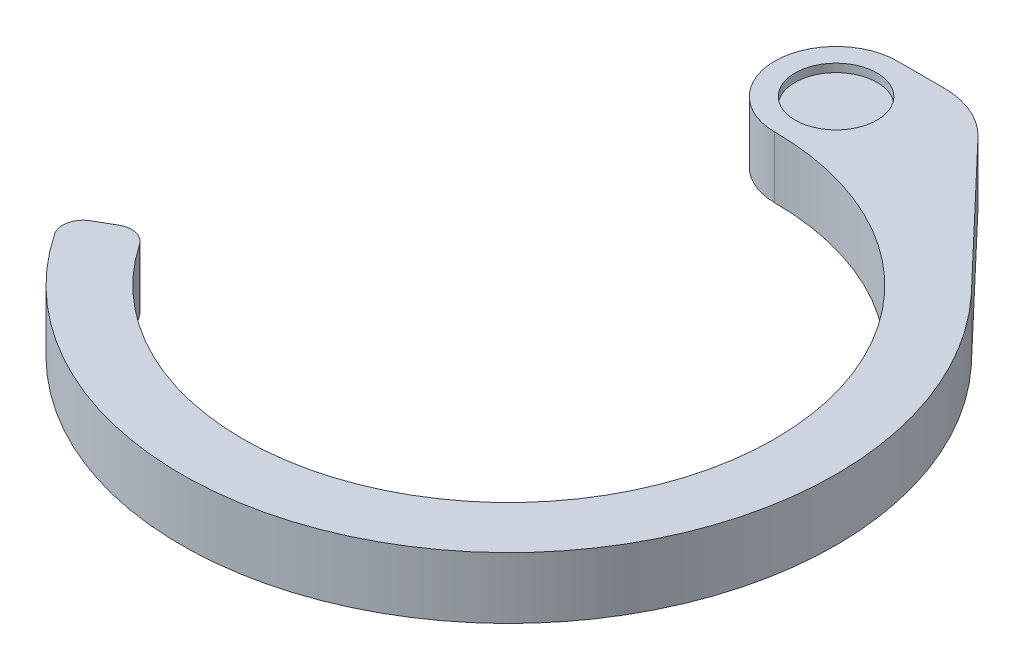
ISO-10303-21;
HEADER;
FILE_DESCRIPTION(('STEP AP214'),'2;1');
FILE_NAME('part.step','',(''),(''),'','','');
FILE_SCHEMA(('AUTOMOTIVE_DESIGN { 1 0 10303 214 1 1 1 1 }'));
ENDSEC;
DATA;
#1=APPLICATION_CONTEXT('core data for automotive mechanical design processes');
#2=APPLICATION_PROTOCOL_DEFINITION('international standard','automotive_design',2000,#1);
#3=PRODUCT_CONTEXT('',#1,'mechanical');
#4=PRODUCT('Part','Part','',(#3));
#5=PRODUCT_RELATED_PRODUCT_CATEGORY('part','',(#4));
#6=PRODUCT_DEFINITION_FORMATION('','',#4);
#7=PRODUCT_DEFINITION_CONTEXT('part definition',#1,'design');
#8=PRODUCT_DEFINITION('design','',#6,#7);
#9=PRODUCT_DEFINITION_SHAPE('','',#8);
#10=(LENGTH_UNIT() NAMED_UNIT(*) SI_UNIT(.MILLI.,.METRE.));
#11=(NAMED_UNIT(*) PLANE_ANGLE_UNIT() SI_UNIT($,.RADIAN.));
#12=(NAMED_UNIT(*) SI_UNIT($,.STERADIAN.) SOLID_ANGLE_UNIT());
#13=UNCERTAINTY_MEASURE_WITH_UNIT(LENGTH_MEASURE(1.E-05),#10,'distance_accuracy_value','');
#14=(GEOMETRIC_REPRESENTATION_CONTEXT(3) GLOBAL_UNCERTAINTY_ASSIGNED_CONTEXT((#13)) GLOBAL_UNIT_ASSIGNED_CONTEXT((#10,
#11,#12)) REPRESENTATION_CONTEXT('',''));
#15=CARTESIAN_POINT('',(0.,0.,0.));
#16=DIRECTION('',(0.,0.,1.));
#17=DIRECTION('',(1.,0.,0.));
#18=AXIS2_PLACEMENT_3D('',#15,#16,#17);
#19=CARTESIAN_POINT('',(-62.3074069840787,15.,41.7467008866615));
#20=DIRECTION('',(0.,-1.,0.));
#21=DIRECTION('',(0.,0.,-1.));
#22=AXIS2_PLACEMENT_3D('',#19,#20,#21);
#23=CYLINDRICAL_SURFACE('',#22,5.00000000000001);
#24=CARTESIAN_POINT('',(-62.3074069840787,0.,41.7467008866615));
#25=DIRECTION('',(0.,1.,0.));
#26=DIRECTION('',(0.,0.,1.));
#27=AXIS2_PLACEMENT_3D('',#24,#25,#26);
#28=CIRCLE('',#27,5.00000000000001);
#29=CARTESIAN_POINT('',(-66.4612341163506,0.,44.5298142791056));
#30=VERTEX_POINT('',#29);
#31=CARTESIAN_POINT('',(-64.8074069840787,0.,37.4165738677393));
#32=VERTEX_POINT('',#31);
#33=EDGE_CURVE('E134',#30,#32,#28,.F.);
#34=ORIENTED_EDGE('',*,*,#33,.F.);
#35=DIRECTION('',(0.,-1.,0.));
#36=VECTOR('',#35,1.);
#37=CARTESIAN_POINT('',(-66.4612341163506,15.,44.5298142791056));
#38=LINE('',#37,#36);
#39=CARTESIAN_POINT('',(-66.4612341163506,15.,44.5298142791056));
#40=VERTEX_POINT('',#39);
#41=EDGE_CURVE('E11',#40,#30,#38,.T.);
#42=ORIENTED_EDGE('',*,*,#41,.F.);
#43=CARTESIAN_POINT('',(-62.3074069840787,15.,41.7467008866615));
#44=DIRECTION('',(0.,1.,0.));
#45=DIRECTION('',(0.,0.,1.));
#46=AXIS2_PLACEMENT_3D('',#43,#44,#45);
#47=CIRCLE('',#46,5.00000000000001);
#48=CARTESIAN_POINT('',(-64.8074069840787,15.,37.4165738677393));
#49=VERTEX_POINT('',#48);
#50=EDGE_CURVE('E157',#40,#49,#47,.F.);
#51=ORIENTED_EDGE('',*,*,#50,.T.);
#52=DIRECTION('',(0.,-1.,0.));
#53=VECTOR('',#52,1.);
#54=CARTESIAN_POINT('',(-64.8074069840787,15.,37.4165738677393));
#55=LINE('',#54,#53);
#56=EDGE_CURVE('E86',#49,#32,#55,.T.);
#57=ORIENTED_EDGE('',*,*,#56,.T.);
#58=EDGE_LOOP('',(#34,#42,#51,#57));
#59=FACE_BOUND('',#58,.T.);
#60=ADVANCED_FACE('F33',(#59),#23,.T.);
#61=CARTESIAN_POINT('',(0.,15.,0.));
#62=DIRECTION('',(0.,-1.,0.));
#63=DIRECTION('',(0.,0.,-1.));
#64=AXIS2_PLACEMENT_3D('',#61,#62,#63);
#65=CYLINDRICAL_SURFACE('',#64,80.);
#66=CARTESIAN_POINT('',(0.,0.,0.));
#67=DIRECTION('',(0.,1.,0.));
#68=DIRECTION('',(0.,0.,1.));
#69=AXIS2_PLACEMENT_3D('',#66,#67,#68);
#70=CIRCLE('',#69,80.);
#71=CARTESIAN_POINT('',(58.5757297296054,0.,-54.4874654085159));
#72=VERTEX_POINT('',#71);
#73=EDGE_CURVE('E137',#30,#72,#70,.T.);
#74=ORIENTED_EDGE('',*,*,#73,.T.);
#75=DIRECTION('',(0.,-1.,0.));
#76=VECTOR('',#75,1.);
#77=CARTESIAN_POINT('',(58.5757297296054,15.,-54.4874654085159));
#78=LINE('',#77,#76);
#79=CARTESIAN_POINT('',(58.5757297296054,15.,-54.4874654085159));
#80=VERTEX_POINT('',#79);
#81=EDGE_CURVE('E41',#80,#72,#78,.T.);
#82=ORIENTED_EDGE('',*,*,#81,.F.);
#83=CARTESIAN_POINT('',(0.,15.,0.));
#84=DIRECTION('',(0.,1.,0.));
#85=DIRECTION('',(0.,0.,1.));
#86=AXIS2_PLACEMENT_3D('',#83,#84,#85);
#87=CIRCLE('',#86,80.);
#88=EDGE_CURVE('E187',#40,#80,#87,.T.);
#89=ORIENTED_EDGE('',*,*,#88,.F.);
#90=ORIENTED_EDGE('',*,*,#41,.T.);
#91=EDGE_LOOP('',(#74,#82,#89,#90));
#92=FACE_BOUND('',#91,.T.);
#93=ADVANCED_FACE('F175',(#92),#65,.T.);
#94=CARTESIAN_POINT('',(57.9325504327501,15.,-55.1629373618664));
#95=DIRECTION('',(0.724206102182212,0.,-0.689583585623996));
#96=DIRECTION('',(-0.689583585623996,0.,-0.724206102182212));
#97=AXIS2_PLACEMENT_3D('',#94,#95,#96);
#98=PLANE('',#97);
#99=DIRECTION('',(0.689583585623996,0.,0.724206102182212));
#100=VECTOR('',#99,1.);
#101=CARTESIAN_POINT('',(57.9325504327501,0.,-55.1629373618664));
#102=LINE('',#101,#100);
#103=CARTESIAN_POINT('',(25.911523347206,0.,-88.7916717124799));
#104=VERTEX_POINT('',#103);
#105=EDGE_CURVE('E141',#104,#72,#102,.T.);
#106=ORIENTED_EDGE('',*,*,#105,.F.);
#107=DIRECTION('',(0.,-1.,0.));
#108=VECTOR('',#107,1.);
#109=CARTESIAN_POINT('',(25.911523347206,15.,-88.7916717124799));
#110=LINE('',#109,#108);
#111=CARTESIAN_POINT('',(25.911523347206,15.,-88.7916717124799));
#112=VERTEX_POINT('',#111);
#113=EDGE_CURVE('E165',#112,#104,#110,.T.);
#114=ORIENTED_EDGE('',*,*,#113,.F.);
#115=DIRECTION('',(0.689583585623996,0.,0.724206102182212));
#116=VECTOR('',#115,1.);
#117=CARTESIAN_POINT('',(57.9325504327501,15.,-55.1629373618664));
#118=LINE('',#117,#116);
#119=EDGE_CURVE('E172',#112,#80,#118,.T.);
#120=ORIENTED_EDGE('',*,*,#119,.T.);
#121=ORIENTED_EDGE('',*,*,#81,.T.);
#122=EDGE_LOOP('',(#106,#114,#120,#121));
#123=FACE_BOUND('',#122,.T.);
#124=ADVANCED_FACE('F170',(#123),#98,.T.);
#125=CARTESIAN_POINT('',(11.4274013035615,15.,-75.));
#126=DIRECTION('',(0.,-1.,0.));
#127=DIRECTION('',(0.,0.,-1.));
#128=AXIS2_PLACEMENT_3D('',#125,#126,#127);
#129=CYLINDRICAL_SURFACE('',#128,20.0000000000001);
#130=CARTESIAN_POINT('',(11.4274013035615,0.,-75.));
#131=DIRECTION('',(0.,1.,0.));
#132=DIRECTION('',(0.,0.,1.));
#133=AXIS2_PLACEMENT_3D('',#130,#131,#132);
#134=CIRCLE('',#133,20.0000000000001);
#135=CARTESIAN_POINT('',(11.4274013035618,0.,-95.));
#136=VERTEX_POINT('',#135);
#137=EDGE_CURVE('E144',#136,#104,#134,.F.);
#138=ORIENTED_EDGE('',*,*,#137,.F.);
#139=DIRECTION('',(0.,-1.,0.));
#140=VECTOR('',#139,1.);
#141=CARTESIAN_POINT('',(11.4274013035618,15.,-95.));
#142=LINE('',#141,#140);
#143=CARTESIAN_POINT('',(11.4274013035618,15.,-95.));
#144=VERTEX_POINT('',#143);
#145=EDGE_CURVE('E163',#144,#136,#142,.T.);
#146=ORIENTED_EDGE('',*,*,#145,.F.);
#147=CARTESIAN_POINT('',(11.4274013035615,15.,-75.));
#148=DIRECTION('',(0.,1.,0.));
#149=DIRECTION('',(0.,0.,1.));
#150=AXIS2_PLACEMENT_3D('',#147,#148,#149);
#151=CIRCLE('',#150,20.0000000000001);
#152=EDGE_CURVE('E185',#144,#112,#151,.F.);
#153=ORIENTED_EDGE('',*,*,#152,.T.);
#154=ORIENTED_EDGE('',*,*,#113,.T.);
#155=EDGE_LOOP('',(#138,#146,#153,#154));
#156=FACE_BOUND('',#155,.T.);
#157=ADVANCED_FACE('F182',(#156),#129,.T.);
#158=CARTESIAN_POINT('',(-1.15370923512719E-13,15.,-95.));
#159=DIRECTION('',(0.,0.,-1.));
#160=DIRECTION('',(-1.,0.,0.));
#161=AXIS2_PLACEMENT_3D('',#158,#159,#160);
#162=PLANE('',#161);
#163=DIRECTION('',(1.,0.,0.));
#164=VECTOR('',#163,1.);
#165=CARTESIAN_POINT('',(-1.15370923512719E-13,0.,-95.));
#166=LINE('',#165,#164);
#167=CARTESIAN_POINT('',(0.,0.,-95.));
#168=VERTEX_POINT('',#167);
#169=EDGE_CURVE('E147',#168,#136,#166,.T.);
#170=ORIENTED_EDGE('',*,*,#169,.F.);
#171=DIRECTION('',(0.,-1.,0.));
#172=VECTOR('',#171,1.);
#173=CARTESIAN_POINT('',(0.,15.,-95.));
#174=LINE('',#173,#172);
#175=CARTESIAN_POINT('',(0.,15.,-95.));
#176=VERTEX_POINT('',#175);
#177=EDGE_CURVE('E161',#176,#168,#174,.T.);
#178=ORIENTED_EDGE('',*,*,#177,.F.);
#179=DIRECTION('',(1.,0.,0.));
#180=VECTOR('',#179,1.);
#181=CARTESIAN_POINT('',(-1.15370923512719E-13,15.,-95.));
#182=LINE('',#181,#180);
#183=EDGE_CURVE('E129',#176,#144,#182,.T.);
#184=ORIENTED_EDGE('',*,*,#183,.T.);
#185=ORIENTED_EDGE('',*,*,#145,.T.);
#186=EDGE_LOOP('',(#170,#178,#184,#185));
#187=FACE_BOUND('',#186,.T.);
#188=ADVANCED_FACE('F193',(#187),#162,.T.);
#189=CARTESIAN_POINT('',(0.,15.,-80.));
#190=DIRECTION('',(0.,-1.,0.));
#191=DIRECTION('',(0.,0.,-1.));
#192=AXIS2_PLACEMENT_3D('',#189,#190,#191);
#193=CYLINDRICAL_SURFACE('',#192,15.);
#194=CARTESIAN_POINT('',(0.,0.,-80.));
#195=DIRECTION('',(0.,1.,0.));
#196=DIRECTION('',(0.,0.,1.));
#197=AXIS2_PLACEMENT_3D('',#194,#195,#196);
#198=CIRCLE('',#197,15.);
#199=CARTESIAN_POINT('',(0.,0.,-65.));
#200=VERTEX_POINT('',#199);
#201=EDGE_CURVE('E150',#168,#200,#198,.T.);
#202=ORIENTED_EDGE('',*,*,#201,.T.);
#203=DIRECTION('',(0.,-1.,0.));
#204=VECTOR('',#203,1.);
#205=CARTESIAN_POINT('',(0.,15.,-65.));
#206=LINE('',#205,#204);
#207=CARTESIAN_POINT('',(0.,15.,-65.));
#208=VERTEX_POINT('',#207);
#209=EDGE_CURVE('E117',#208,#200,#206,.T.);
#210=ORIENTED_EDGE('',*,*,#209,.F.);
#211=CARTESIAN_POINT('',(0.,15.,-80.));
#212=DIRECTION('',(0.,1.,0.));
#213=DIRECTION('',(0.,0.,1.));
#214=AXIS2_PLACEMENT_3D('',#211,#212,#213);
#215=CIRCLE('',#214,15.);
#216=EDGE_CURVE('E126',#176,#208,#215,.T.);
#217=ORIENTED_EDGE('',*,*,#216,.F.);
#218=ORIENTED_EDGE('',*,*,#177,.T.);
#219=EDGE_LOOP('',(#202,#210,#217,#218));
#220=FACE_BOUND('',#219,.T.);
#221=ADVANCED_FACE('F195',(#220),#193,.T.);
#222=CARTESIAN_POINT('',(0.,15.,0.));
#223=DIRECTION('',(0.,-1.,0.));
#224=DIRECTION('',(0.,0.,-1.));
#225=AXIS2_PLACEMENT_3D('',#222,#223,#224);
#226=CYLINDRICAL_SURFACE('',#225,65.);
#227=CARTESIAN_POINT('',(0.,0.,0.));
#228=DIRECTION('',(0.,1.,0.));
#229=DIRECTION('',(0.,0.,1.));
#230=AXIS2_PLACEMENT_3D('',#227,#228,#229);
#231=CIRCLE('',#230,65.);
#232=CARTESIAN_POINT('',(-53.8264378899364,0.,36.4378180477484));
#233=VERTEX_POINT('',#232);
#234=EDGE_CURVE('E116',#233,#200,#231,.T.);
#235=ORIENTED_EDGE('',*,*,#234,.F.);
#236=DIRECTION('',(0.,-1.,0.));
#237=VECTOR('',#236,1.);
#238=CARTESIAN_POINT('',(-53.8264378899364,15.,36.4378180477484));
#239=LINE('',#238,#237);
#240=CARTESIAN_POINT('',(-53.8264378899364,15.,36.4378180477484));
#241=VERTEX_POINT('',#240);
#242=EDGE_CURVE('E110',#241,#233,#239,.T.);
#243=ORIENTED_EDGE('',*,*,#242,.F.);
#244=CARTESIAN_POINT('',(0.,15.,0.));
#245=DIRECTION('',(0.,1.,0.));
#246=DIRECTION('',(0.,0.,1.));
#247=AXIS2_PLACEMENT_3D('',#244,#245,#246);
#248=CIRCLE('',#247,65.);
#249=EDGE_CURVE('E114',#241,#208,#248,.T.);
#250=ORIENTED_EDGE('',*,*,#249,.T.);
#251=ORIENTED_EDGE('',*,*,#209,.T.);
#252=EDGE_LOOP('',(#235,#243,#250,#251));
#253=FACE_BOUND('',#252,.T.);
#254=ADVANCED_FACE('F112',(#253),#226,.F.);
#255=CARTESIAN_POINT('',(-57.9669331122392,15.,39.2407271283444));
#256=DIRECTION('',(0.,-1.,0.));
#257=DIRECTION('',(0.,0.,-1.));
#258=AXIS2_PLACEMENT_3D('',#255,#256,#257);
#259=CYLINDRICAL_SURFACE('',#258,5.);
#260=CARTESIAN_POINT('',(-57.9669331122392,0.,39.2407271283444));
#261=DIRECTION('',(0.,1.,0.));
#262=DIRECTION('',(0.,0.,1.));
#263=AXIS2_PLACEMENT_3D('',#260,#261,#262);
#264=CIRCLE('',#263,5.);
#265=CARTESIAN_POINT('',(-60.4669331122392,0.,34.9106001094222));
#266=VERTEX_POINT('',#265);
#267=EDGE_CURVE('E79',#233,#266,#264,.T.);
#268=ORIENTED_EDGE('',*,*,#267,.T.);
#269=DIRECTION('',(0.,-1.,0.));
#270=VECTOR('',#269,1.);
#271=CARTESIAN_POINT('',(-60.4669331122392,15.,34.9106001094222));
#272=LINE('',#271,#270);
#273=CARTESIAN_POINT('',(-60.4669331122392,15.,34.9106001094222));
#274=VERTEX_POINT('',#273);
#275=EDGE_CURVE('E118',#274,#266,#272,.T.);
#276=ORIENTED_EDGE('',*,*,#275,.F.);
#277=CARTESIAN_POINT('',(-57.9669331122392,15.,39.2407271283444));
#278=DIRECTION('',(0.,1.,0.));
#279=DIRECTION('',(0.,0.,1.));
#280=AXIS2_PLACEMENT_3D('',#277,#278,#279);
#281=CIRCLE('',#280,5.);
#282=EDGE_CURVE('E120',#241,#274,#281,.T.);
#283=ORIENTED_EDGE('',*,*,#282,.F.);
#284=ORIENTED_EDGE('',*,*,#242,.T.);
#285=EDGE_LOOP('',(#268,#276,#283,#284));
#286=FACE_BOUND('',#285,.T.);
#287=ADVANCED_FACE('F121',(#286),#259,.T.);
#288=CARTESIAN_POINT('',(0.,15.,0.));
#289=DIRECTION('',(0.499999999999997,0.,0.86602540378444));
#290=DIRECTION('',(0.86602540378444,0.,-0.499999999999997));
#291=AXIS2_PLACEMENT_3D('',#288,#289,#290);
#292=PLANE('',#291);
#293=DIRECTION('',(-0.86602540378444,0.,0.499999999999997));
#294=VECTOR('',#293,1.);
#295=CARTESIAN_POINT('',(0.,0.,0.));
#296=LINE('',#295,#294);
#297=EDGE_CURVE('E155',#266,#32,#296,.T.);
#298=ORIENTED_EDGE('',*,*,#297,.T.);
#299=ORIENTED_EDGE('',*,*,#56,.F.);
#300=DIRECTION('',(-0.86602540378444,0.,0.499999999999997));
#301=VECTOR('',#300,1.);
#302=CARTESIAN_POINT('',(0.,15.,0.));
#303=LINE('',#302,#301);
#304=EDGE_CURVE('E49',#274,#49,#303,.T.);
#305=ORIENTED_EDGE('',*,*,#304,.F.);
#306=ORIENTED_EDGE('',*,*,#275,.T.);
#307=EDGE_LOOP('',(#298,#299,#305,#306));
#308=FACE_BOUND('',#307,.T.);
#309=ADVANCED_FACE('F198',(#308),#292,.F.);
#310=CARTESIAN_POINT('',(0.,15.,0.));
#311=DIRECTION('',(0.,1.,0.));
#312=DIRECTION('',(0.,0.,1.));
#313=AXIS2_PLACEMENT_3D('',#310,#311,#312);
#314=PLANE('',#313);
#315=CARTESIAN_POINT('',(0.,15.,-80.));
#316=DIRECTION('',(0.,1.,0.));
#317=DIRECTION('',(0.,0.,1.));
#318=AXIS2_PLACEMENT_3D('',#315,#316,#317);
#319=CIRCLE('',#318,10.);
#320=CARTESIAN_POINT('',(0.,15.,-70.));
#321=VERTEX_POINT('',#320);
#322=EDGE_CURVE('E200',#321,#321,#319,.T.);
#323=ORIENTED_EDGE('',*,*,#322,.F.);
#324=EDGE_LOOP('',(#323));
#325=FACE_BOUND('',#324,.T.);
#326=ORIENTED_EDGE('',*,*,#50,.F.);
#327=ORIENTED_EDGE('',*,*,#88,.T.);
#328=ORIENTED_EDGE('',*,*,#119,.F.);
#329=ORIENTED_EDGE('',*,*,#152,.F.);
#330=ORIENTED_EDGE('',*,*,#183,.F.);
#331=ORIENTED_EDGE('',*,*,#216,.T.);
#332=ORIENTED_EDGE('',*,*,#249,.F.);
#333=ORIENTED_EDGE('',*,*,#282,.T.);
#334=ORIENTED_EDGE('',*,*,#304,.T.);
#335=EDGE_LOOP('',(#326,#327,#328,#329,#330,#331,#332,#333,#334));
#336=FACE_BOUND('',#335,.T.);
#337=ADVANCED_FACE('F123',(#325,#336),#314,.T.);
#338=CARTESIAN_POINT('',(0.,0.,0.));
#339=DIRECTION('',(0.,1.,0.));
#340=DIRECTION('',(0.,0.,1.));
#341=AXIS2_PLACEMENT_3D('',#338,#339,#340);
#342=PLANE('',#341);
#343=ORIENTED_EDGE('',*,*,#33,.T.);
#344=ORIENTED_EDGE('',*,*,#297,.F.);
#345=ORIENTED_EDGE('',*,*,#267,.F.);
#346=ORIENTED_EDGE('',*,*,#234,.T.);
#347=ORIENTED_EDGE('',*,*,#201,.F.);
#348=ORIENTED_EDGE('',*,*,#169,.T.);
#349=ORIENTED_EDGE('',*,*,#137,.T.);
#350=ORIENTED_EDGE('',*,*,#105,.T.);
#351=ORIENTED_EDGE('',*,*,#73,.F.);
#352=EDGE_LOOP('',(#343,#344,#345,#346,#347,#348,#349,#350,#351));
#353=FACE_BOUND('',#352,.T.);
#354=ADVANCED_FACE('F177',(#353),#342,.F.);
#355=CARTESIAN_POINT('',(0.,13.,-80.));
#356=DIRECTION('',(0.,1.,0.));
#357=DIRECTION('',(0.,0.,1.));
#358=AXIS2_PLACEMENT_3D('',#355,#356,#357);
#359=CYLINDRICAL_SURFACE('',#358,10.);
#360=CARTESIAN_POINT('',(0.,13.,-80.));
#361=DIRECTION('',(0.,1.,0.));
#362=DIRECTION('',(0.,0.,1.));
#363=AXIS2_PLACEMENT_3D('',#360,#361,#362);
#364=CIRCLE('',#363,10.);
#365=CARTESIAN_POINT('',(0.,13.,-70.));
#366=VERTEX_POINT('',#365);
#367=EDGE_CURVE('E138',#366,#366,#364,.T.);
#368=ORIENTED_EDGE('',*,*,#367,.F.);
#369=EDGE_LOOP('',(#368));
#370=FACE_BOUND('',#369,.T.);
#371=ORIENTED_EDGE('',*,*,#322,.T.);
#372=EDGE_LOOP('',(#371));
#373=FACE_BOUND('',#372,.T.);
#374=ADVANCED_FACE('F208',(#370,#373),#359,.F.);
#375=CARTESIAN_POINT('',(0.,13.,-80.));
#376=DIRECTION('',(0.,1.,0.));
#377=DIRECTION('',(0.,0.,1.));
#378=AXIS2_PLACEMENT_3D('',#375,#376,#377);
#379=PLANE('',#378);
#380=ORIENTED_EDGE('',*,*,#367,.T.);
#381=EDGE_LOOP('',(#380));
#382=FACE_BOUND('',#381,.T.);
#383=ADVANCED_FACE('F206',(#382),#379,.T.);
#384=CLOSED_SHELL('',(#60,#93,#124,#157,#188,#221,#254,#287,#309,#337,#354,#374,#383));
#385=MANIFOLD_SOLID_BREP('B2',#384);
#386=ADVANCED_BREP_SHAPE_REPRESENTATION('',(#18,#385),#14);
#387=SHAPE_DEFINITION_REPRESENTATION(#9,#386);
ENDSEC;
END-ISO-10303-21;
